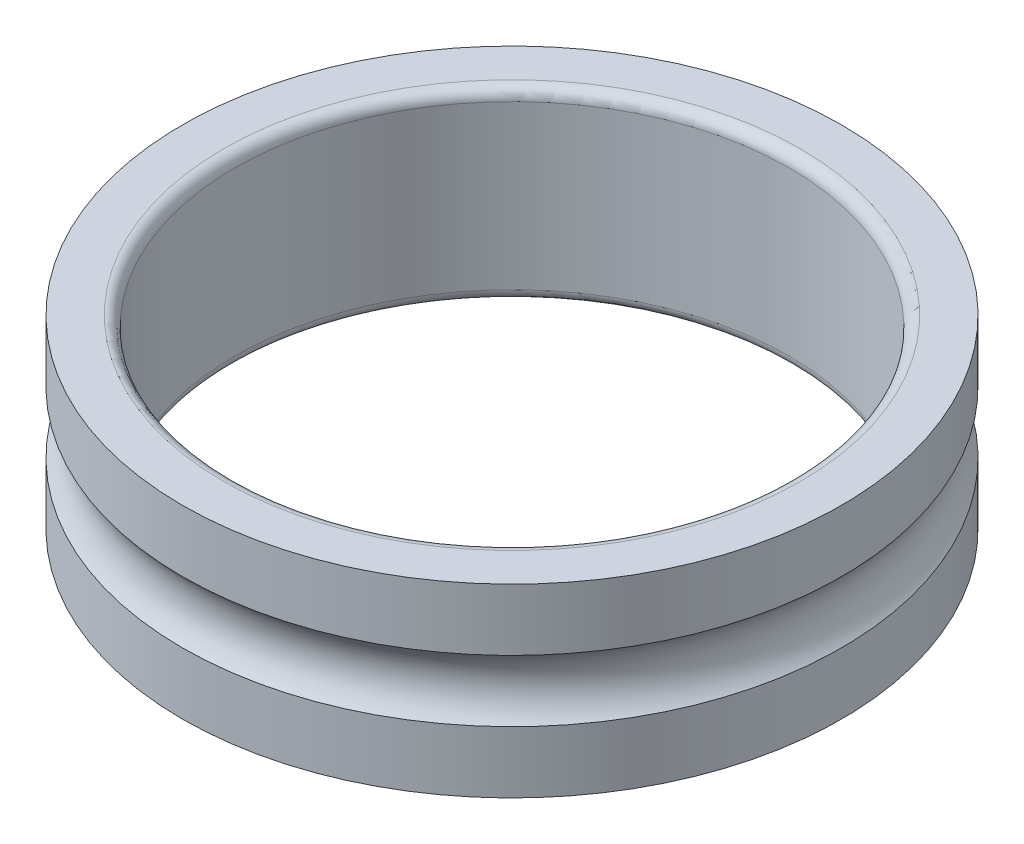
ISO-10303-21;
HEADER;
FILE_DESCRIPTION(('STEP AP214'),'2;1');
FILE_NAME('part.step','',(''),(''),'','','');
FILE_SCHEMA(('AUTOMOTIVE_DESIGN { 1 0 10303 214 1 1 1 1 }'));
ENDSEC;
DATA;
#1=APPLICATION_CONTEXT('core data for automotive mechanical design processes');
#2=APPLICATION_PROTOCOL_DEFINITION('international standard','automotive_design',2000,#1);
#3=PRODUCT_CONTEXT('',#1,'mechanical');
#4=PRODUCT('Part','Part','',(#3));
#5=PRODUCT_RELATED_PRODUCT_CATEGORY('part','',(#4));
#6=PRODUCT_DEFINITION_FORMATION('','',#4);
#7=PRODUCT_DEFINITION_CONTEXT('part definition',#1,'design');
#8=PRODUCT_DEFINITION('design','',#6,#7);
#9=PRODUCT_DEFINITION_SHAPE('','',#8);
#10=(LENGTH_UNIT() NAMED_UNIT(*) SI_UNIT(.MILLI.,.METRE.));
#11=(NAMED_UNIT(*) PLANE_ANGLE_UNIT() SI_UNIT($,.RADIAN.));
#12=(NAMED_UNIT(*) SI_UNIT($,.STERADIAN.) SOLID_ANGLE_UNIT());
#13=UNCERTAINTY_MEASURE_WITH_UNIT(LENGTH_MEASURE(1.E-05),#10,'distance_accuracy_value','');
#14=(GEOMETRIC_REPRESENTATION_CONTEXT(3) GLOBAL_UNCERTAINTY_ASSIGNED_CONTEXT((#13)) GLOBAL_UNIT_ASSIGNED_CONTEXT((#10,
#11,#12)) REPRESENTATION_CONTEXT('',''));
#15=CARTESIAN_POINT('',(0.,0.,0.));
#16=DIRECTION('',(0.,0.,1.));
#17=DIRECTION('',(1.,0.,0.));
#18=AXIS2_PLACEMENT_3D('',#15,#16,#17);
#19=CARTESIAN_POINT('',(0.,-2.5,0.));
#20=DIRECTION('',(0.,1.,0.));
#21=DIRECTION('',(1.,0.,0.));
#22=AXIS2_PLACEMENT_3D('',#19,#20,#21);
#23=PLANE('',#22);
#24=CARTESIAN_POINT('',(0.,-2.5,0.));
#25=DIRECTION('',(0.,1.,0.));
#26=DIRECTION('',(0.,0.,-1.));
#27=AXIS2_PLACEMENT_3D('',#24,#25,#26);
#28=CIRCLE('',#27,7.785);
#29=CARTESIAN_POINT('',(0.,-2.5,-7.785));
#30=VERTEX_POINT('',#29);
#31=EDGE_CURVE('E74',#30,#30,#28,.T.);
#32=ORIENTED_EDGE('',*,*,#31,.T.);
#33=EDGE_LOOP('',(#32));
#34=FACE_BOUND('',#33,.T.);
#35=CARTESIAN_POINT('',(0.,-2.5,0.));
#36=DIRECTION('',(0.,-1.,0.));
#37=DIRECTION('',(0.,0.,-1.));
#38=AXIS2_PLACEMENT_3D('',#35,#36,#37);
#39=CIRCLE('',#38,8.9);
#40=CARTESIAN_POINT('',(0.,-2.5,8.9));
#41=VERTEX_POINT('',#40);
#42=EDGE_CURVE('E11',#41,#41,#39,.T.);
#43=ORIENTED_EDGE('',*,*,#42,.T.);
#44=EDGE_LOOP('',(#43));
#45=FACE_BOUND('',#44,.T.);
#46=ADVANCED_FACE('F17',(#34,#45),#23,.F.);
#47=CARTESIAN_POINT('',(0.,-2.75,0.));
#48=DIRECTION('',(0.,1.,0.));
#49=DIRECTION('',(0.,0.,-1.));
#50=AXIS2_PLACEMENT_3D('',#47,#48,#49);
#51=CYLINDRICAL_SURFACE('',#50,8.9);
#52=CARTESIAN_POINT('',(0.,-0.8330306116824,0.));
#53=DIRECTION('',(0.,-1.,0.));
#54=DIRECTION('',(0.,0.,-1.));
#55=AXIS2_PLACEMENT_3D('',#52,#53,#54);
#56=CIRCLE('',#55,8.9);
#57=CARTESIAN_POINT('',(0.,-0.8330306116824,-8.9));
#58=VERTEX_POINT('',#57);
#59=EDGE_CURVE('E27',#58,#58,#56,.T.);
#60=ORIENTED_EDGE('',*,*,#59,.T.);
#61=EDGE_LOOP('',(#60));
#62=FACE_BOUND('',#61,.T.);
#63=ORIENTED_EDGE('',*,*,#42,.F.);
#64=EDGE_LOOP('',(#63));
#65=FACE_BOUND('',#64,.T.);
#66=ADVANCED_FACE('F109',(#62,#65),#51,.T.);
#67=CARTESIAN_POINT('',(0.,0.,0.));
#68=DIRECTION('',(0.,1.,0.));
#69=DIRECTION('',(0.,0.,-1.));
#70=AXIS2_PLACEMENT_3D('',#67,#68,#69);
#71=TOROIDAL_SURFACE('',#70,9.7505,1.1905);
#72=ORIENTED_EDGE('',*,*,#59,.F.);
#73=EDGE_LOOP('',(#72));
#74=FACE_BOUND('',#73,.T.);
#75=CARTESIAN_POINT('',(0.,0.8330306116824,0.));
#76=DIRECTION('',(0.,-1.,0.));
#77=DIRECTION('',(0.,0.,-1.));
#78=AXIS2_PLACEMENT_3D('',#75,#76,#77);
#79=CIRCLE('',#78,8.9);
#80=CARTESIAN_POINT('',(0.,0.8330306116824,8.9));
#81=VERTEX_POINT('',#80);
#82=EDGE_CURVE('E85',#81,#81,#79,.T.);
#83=ORIENTED_EDGE('',*,*,#82,.T.);
#84=EDGE_LOOP('',(#83));
#85=FACE_BOUND('',#84,.T.);
#86=ADVANCED_FACE('F96',(#74,#85),#71,.F.);
#87=CARTESIAN_POINT('',(0.,-2.75,0.));
#88=DIRECTION('',(0.,1.,0.));
#89=DIRECTION('',(0.,0.,-1.));
#90=AXIS2_PLACEMENT_3D('',#87,#88,#89);
#91=CYLINDRICAL_SURFACE('',#90,8.9);
#92=CARTESIAN_POINT('',(0.,2.5,0.));
#93=DIRECTION('',(0.,1.,0.));
#94=DIRECTION('',(0.,0.,-1.));
#95=AXIS2_PLACEMENT_3D('',#92,#93,#94);
#96=CIRCLE('',#95,8.9);
#97=CARTESIAN_POINT('',(0.,2.5,8.9));
#98=VERTEX_POINT('',#97);
#99=EDGE_CURVE('E82',#98,#98,#96,.T.);
#100=ORIENTED_EDGE('',*,*,#99,.F.);
#101=EDGE_LOOP('',(#100));
#102=FACE_BOUND('',#101,.T.);
#103=ORIENTED_EDGE('',*,*,#82,.F.);
#104=EDGE_LOOP('',(#103));
#105=FACE_BOUND('',#104,.T.);
#106=ADVANCED_FACE('F98',(#102,#105),#91,.T.);
#107=CARTESIAN_POINT('',(0.,2.5,0.));
#108=DIRECTION('',(0.,1.,0.));
#109=DIRECTION('',(1.,0.,0.));
#110=AXIS2_PLACEMENT_3D('',#107,#108,#109);
#111=PLANE('',#110);
#112=CARTESIAN_POINT('',(0.,2.5,0.));
#113=DIRECTION('',(0.,-1.,0.));
#114=DIRECTION('',(0.,0.,-1.));
#115=AXIS2_PLACEMENT_3D('',#112,#113,#114);
#116=CIRCLE('',#115,7.785);
#117=CARTESIAN_POINT('',(0.,2.5,7.785));
#118=VERTEX_POINT('',#117);
#119=EDGE_CURVE('E53',#118,#118,#116,.T.);
#120=ORIENTED_EDGE('',*,*,#119,.T.);
#121=EDGE_LOOP('',(#120));
#122=FACE_BOUND('',#121,.T.);
#123=ORIENTED_EDGE('',*,*,#99,.T.);
#124=EDGE_LOOP('',(#123));
#125=FACE_BOUND('',#124,.T.);
#126=ADVANCED_FACE('F100',(#122,#125),#111,.T.);
#127=CARTESIAN_POINT('',(0.,2.2,0.));
#128=DIRECTION('',(0.,1.,0.));
#129=DIRECTION('',(0.,0.,-1.));
#130=AXIS2_PLACEMENT_3D('',#127,#128,#129);
#131=TOROIDAL_SURFACE('',#130,7.785,0.3);
#132=CARTESIAN_POINT('',(0.,2.2,0.));
#133=DIRECTION('',(0.,-1.,0.));
#134=DIRECTION('',(0.,0.,-1.));
#135=AXIS2_PLACEMENT_3D('',#132,#133,#134);
#136=CIRCLE('',#135,7.485);
#137=CARTESIAN_POINT('',(0.,2.2,-7.485));
#138=VERTEX_POINT('',#137);
#139=EDGE_CURVE('E63',#138,#138,#136,.T.);
#140=ORIENTED_EDGE('',*,*,#139,.T.);
#141=EDGE_LOOP('',(#140));
#142=FACE_BOUND('',#141,.T.);
#143=ORIENTED_EDGE('',*,*,#119,.F.);
#144=EDGE_LOOP('',(#143));
#145=FACE_BOUND('',#144,.T.);
#146=ADVANCED_FACE('F19',(#142,#145),#131,.T.);
#147=CARTESIAN_POINT('',(0.,-2.75,0.));
#148=DIRECTION('',(0.,1.,0.));
#149=DIRECTION('',(0.,0.,-1.));
#150=AXIS2_PLACEMENT_3D('',#147,#148,#149);
#151=CYLINDRICAL_SURFACE('',#150,7.485);
#152=ORIENTED_EDGE('',*,*,#139,.F.);
#153=EDGE_LOOP('',(#152));
#154=FACE_BOUND('',#153,.T.);
#155=CARTESIAN_POINT('',(0.,-2.2,0.));
#156=DIRECTION('',(0.,-1.,0.));
#157=DIRECTION('',(0.,0.,-1.));
#158=AXIS2_PLACEMENT_3D('',#155,#156,#157);
#159=CIRCLE('',#158,7.485);
#160=CARTESIAN_POINT('',(0.,-2.2,7.485));
#161=VERTEX_POINT('',#160);
#162=EDGE_CURVE('E70',#161,#161,#159,.T.);
#163=ORIENTED_EDGE('',*,*,#162,.T.);
#164=EDGE_LOOP('',(#163));
#165=FACE_BOUND('',#164,.T.);
#166=ADVANCED_FACE('F71',(#154,#165),#151,.F.);
#167=CARTESIAN_POINT('',(0.,-2.2,0.));
#168=DIRECTION('',(0.,1.,0.));
#169=DIRECTION('',(0.,0.,-1.));
#170=AXIS2_PLACEMENT_3D('',#167,#168,#169);
#171=TOROIDAL_SURFACE('',#170,7.785,0.3);
#172=ORIENTED_EDGE('',*,*,#31,.F.);
#173=EDGE_LOOP('',(#172));
#174=FACE_BOUND('',#173,.T.);
#175=ORIENTED_EDGE('',*,*,#162,.F.);
#176=EDGE_LOOP('',(#175));
#177=FACE_BOUND('',#176,.T.);
#178=ADVANCED_FACE('F122',(#174,#177),#171,.T.);
#179=CLOSED_SHELL('',(#46,#66,#86,#106,#126,#146,#166,#178));
#180=MANIFOLD_SOLID_BREP('B1',#179);
#181=ADVANCED_BREP_SHAPE_REPRESENTATION('',(#18,#180),#14);
#182=SHAPE_DEFINITION_REPRESENTATION(#9,#181);
ENDSEC;
END-ISO-10303-21;
